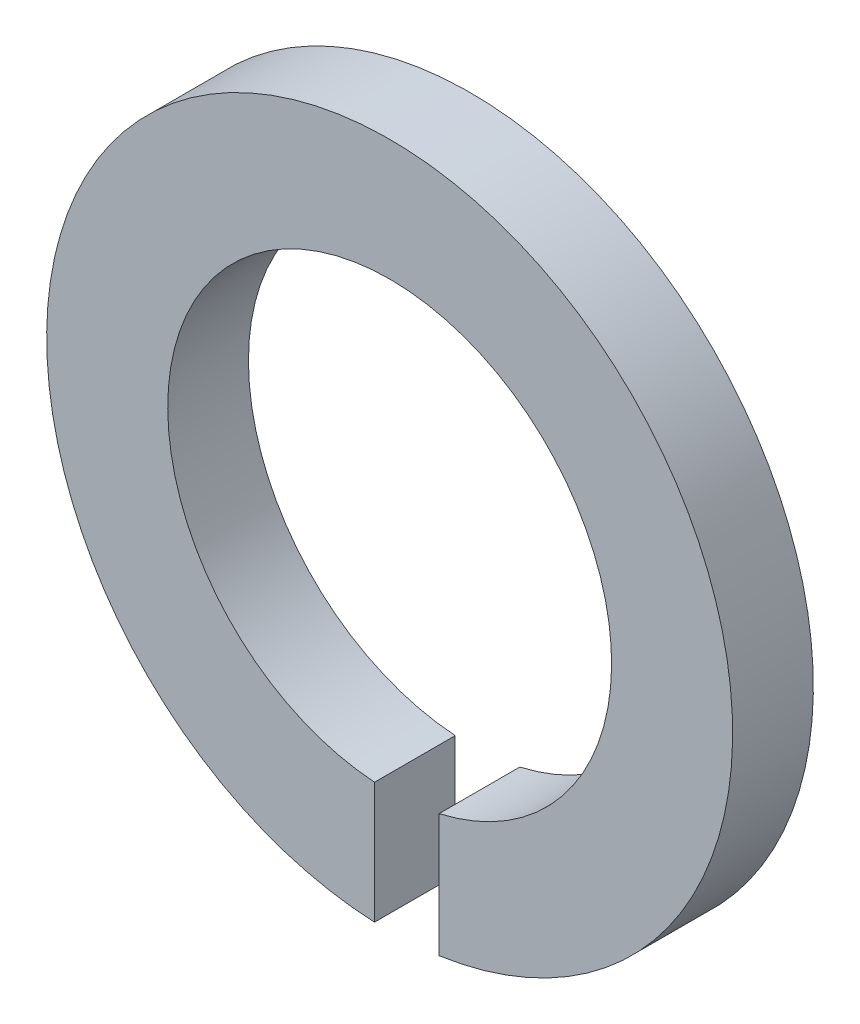
ISO-10303-21;
HEADER;
FILE_DESCRIPTION(('STEP AP214'),'2;1');
FILE_NAME('part.step','',(''),(''),'','','');
FILE_SCHEMA(('AUTOMOTIVE_DESIGN { 1 0 10303 214 1 1 1 1 }'));
ENDSEC;
DATA;
#1=APPLICATION_CONTEXT('core data for automotive mechanical design processes');
#2=APPLICATION_PROTOCOL_DEFINITION('international standard','automotive_design',2000,#1);
#3=PRODUCT_CONTEXT('',#1,'mechanical');
#4=PRODUCT('Part','Part','',(#3));
#5=PRODUCT_RELATED_PRODUCT_CATEGORY('part','',(#4));
#6=PRODUCT_DEFINITION_FORMATION('','',#4);
#7=PRODUCT_DEFINITION_CONTEXT('part definition',#1,'design');
#8=PRODUCT_DEFINITION('design','',#6,#7);
#9=PRODUCT_DEFINITION_SHAPE('','',#8);
#10=(LENGTH_UNIT() NAMED_UNIT(*) SI_UNIT(.MILLI.,.METRE.));
#11=(NAMED_UNIT(*) PLANE_ANGLE_UNIT() SI_UNIT($,.RADIAN.));
#12=(NAMED_UNIT(*) SI_UNIT($,.STERADIAN.) SOLID_ANGLE_UNIT());
#13=UNCERTAINTY_MEASURE_WITH_UNIT(LENGTH_MEASURE(1.E-05),#10,'distance_accuracy_value','');
#14=(GEOMETRIC_REPRESENTATION_CONTEXT(3) GLOBAL_UNCERTAINTY_ASSIGNED_CONTEXT((#13)) GLOBAL_UNIT_ASSIGNED_CONTEXT((#10,
#11,#12)) REPRESENTATION_CONTEXT('',''));
#15=CARTESIAN_POINT('',(0.,0.,0.));
#16=DIRECTION('',(0.,0.,1.));
#17=DIRECTION('',(1.,0.,0.));
#18=AXIS2_PLACEMENT_3D('',#15,#16,#17);
#19=CARTESIAN_POINT('',(0.,0.,0.));
#20=DIRECTION('',(0.,0.,1.));
#21=DIRECTION('',(1.,0.,0.));
#22=AXIS2_PLACEMENT_3D('',#19,#20,#21);
#23=PLANE('',#22);
#24=DIRECTION('',(0.,1.,0.));
#25=VECTOR('',#24,1.);
#26=CARTESIAN_POINT('',(0.49,-3.4,0.));
#27=LINE('',#26,#25);
#28=CARTESIAN_POINT('',(0.49,-2.14473774620582,0.));
#29=VERTEX_POINT('',#28);
#30=CARTESIAN_POINT('',(0.49,-3.36450590726187,0.));
#31=VERTEX_POINT('',#30);
#32=EDGE_CURVE('E77',#29,#31,#27,.F.);
#33=ORIENTED_EDGE('',*,*,#32,.T.);
#34=CARTESIAN_POINT('',(0.,0.,0.));
#35=DIRECTION('',(0.,0.,1.));
#36=DIRECTION('',(1.,0.,0.));
#37=AXIS2_PLACEMENT_3D('',#34,#35,#36);
#38=CIRCLE('',#37,3.4);
#39=CARTESIAN_POINT('',(-0.15,-3.39668956485576,0.));
#40=VERTEX_POINT('',#39);
#41=EDGE_CURVE('E20',#40,#31,#38,.F.);
#42=ORIENTED_EDGE('',*,*,#41,.F.);
#43=DIRECTION('',(0.,1.,0.));
#44=VECTOR('',#43,1.);
#45=CARTESIAN_POINT('',(-0.15,-3.4,0.));
#46=LINE('',#45,#44);
#47=CARTESIAN_POINT('',(-0.15,-2.1948804067648,0.));
#48=VERTEX_POINT('',#47);
#49=EDGE_CURVE('E62',#40,#48,#46,.T.);
#50=ORIENTED_EDGE('',*,*,#49,.T.);
#51=CARTESIAN_POINT('',(0.,0.,0.));
#52=DIRECTION('',(0.,0.,1.));
#53=DIRECTION('',(1.,0.,0.));
#54=AXIS2_PLACEMENT_3D('',#51,#52,#53);
#55=CIRCLE('',#54,2.2);
#56=EDGE_CURVE('E78',#48,#29,#55,.F.);
#57=ORIENTED_EDGE('',*,*,#56,.T.);
#58=EDGE_LOOP('',(#33,#42,#50,#57));
#59=FACE_BOUND('',#58,.T.);
#60=ADVANCED_FACE('F17',(#59),#23,.T.);
#61=CARTESIAN_POINT('',(0.49,-3.4,0.));
#62=DIRECTION('',(1.,0.,0.));
#63=DIRECTION('',(0.,0.,-1.));
#64=AXIS2_PLACEMENT_3D('',#61,#62,#63);
#65=PLANE('',#64);
#66=ORIENTED_EDGE('',*,*,#32,.F.);
#67=DIRECTION('',(0.,0.,1.));
#68=VECTOR('',#67,1.);
#69=CARTESIAN_POINT('',(0.489999999999999,-2.14473774620582,-0.8));
#70=LINE('',#69,#68);
#71=CARTESIAN_POINT('',(0.49,-2.14473774620582,-0.8));
#72=VERTEX_POINT('',#71);
#73=EDGE_CURVE('E100',#29,#72,#70,.F.);
#74=ORIENTED_EDGE('',*,*,#73,.T.);
#75=DIRECTION('',(0.,1.,0.));
#76=VECTOR('',#75,1.);
#77=CARTESIAN_POINT('',(0.49,0.,-0.8));
#78=LINE('',#77,#76);
#79=CARTESIAN_POINT('',(0.49,-3.36450590726187,-0.8));
#80=VERTEX_POINT('',#79);
#81=EDGE_CURVE('E87',#72,#80,#78,.F.);
#82=ORIENTED_EDGE('',*,*,#81,.T.);
#83=DIRECTION('',(0.,0.,1.));
#84=VECTOR('',#83,1.);
#85=CARTESIAN_POINT('',(0.489999999999999,-3.36450590726187,-0.8));
#86=LINE('',#85,#84);
#87=EDGE_CURVE('E71',#31,#80,#86,.F.);
#88=ORIENTED_EDGE('',*,*,#87,.F.);
#89=EDGE_LOOP('',(#66,#74,#82,#88));
#90=FACE_BOUND('',#89,.T.);
#91=ADVANCED_FACE('F85',(#90),#65,.F.);
#92=CARTESIAN_POINT('',(0.,0.,-0.8));
#93=DIRECTION('',(0.,0.,1.));
#94=DIRECTION('',(1.,0.,0.));
#95=AXIS2_PLACEMENT_3D('',#92,#93,#94);
#96=CYLINDRICAL_SURFACE('',#95,3.4);
#97=DIRECTION('',(0.,0.,1.));
#98=VECTOR('',#97,1.);
#99=CARTESIAN_POINT('',(-0.15,-3.39668956485576,0.));
#100=LINE('',#99,#98);
#101=CARTESIAN_POINT('',(-0.15,-3.39668956485576,-0.8));
#102=VERTEX_POINT('',#101);
#103=EDGE_CURVE('E73',#102,#40,#100,.T.);
#104=ORIENTED_EDGE('',*,*,#103,.T.);
#105=ORIENTED_EDGE('',*,*,#41,.T.);
#106=ORIENTED_EDGE('',*,*,#87,.T.);
#107=CARTESIAN_POINT('',(0.,0.,-0.8));
#108=DIRECTION('',(0.,0.,1.));
#109=DIRECTION('',(1.,0.,0.));
#110=AXIS2_PLACEMENT_3D('',#107,#108,#109);
#111=CIRCLE('',#110,3.4);
#112=EDGE_CURVE('E97',#80,#102,#111,.T.);
#113=ORIENTED_EDGE('',*,*,#112,.T.);
#114=EDGE_LOOP('',(#104,#105,#106,#113));
#115=FACE_BOUND('',#114,.T.);
#116=ADVANCED_FACE('F69',(#115),#96,.T.);
#117=CARTESIAN_POINT('',(-0.15,-3.4,0.));
#118=DIRECTION('',(-1.,0.,0.));
#119=DIRECTION('',(0.,0.,1.));
#120=AXIS2_PLACEMENT_3D('',#117,#118,#119);
#121=PLANE('',#120);
#122=DIRECTION('',(0.,1.,0.));
#123=VECTOR('',#122,1.);
#124=CARTESIAN_POINT('',(-0.15,0.,-0.8));
#125=LINE('',#124,#123);
#126=CARTESIAN_POINT('',(-0.15,-2.1948804067648,-0.8));
#127=VERTEX_POINT('',#126);
#128=EDGE_CURVE('E27',#102,#127,#125,.T.);
#129=ORIENTED_EDGE('',*,*,#128,.T.);
#130=DIRECTION('',(0.,0.,1.));
#131=VECTOR('',#130,1.);
#132=CARTESIAN_POINT('',(-0.149999999999999,-2.1948804067648,-0.8));
#133=LINE('',#132,#131);
#134=EDGE_CURVE('E39',#127,#48,#133,.T.);
#135=ORIENTED_EDGE('',*,*,#134,.T.);
#136=ORIENTED_EDGE('',*,*,#49,.F.);
#137=ORIENTED_EDGE('',*,*,#103,.F.);
#138=EDGE_LOOP('',(#129,#135,#136,#137));
#139=FACE_BOUND('',#138,.T.);
#140=ADVANCED_FACE('F110',(#139),#121,.F.);
#141=CARTESIAN_POINT('',(0.,0.,-0.8));
#142=DIRECTION('',(0.,0.,1.));
#143=DIRECTION('',(1.,0.,0.));
#144=AXIS2_PLACEMENT_3D('',#141,#142,#143);
#145=CYLINDRICAL_SURFACE('',#144,2.2);
#146=CARTESIAN_POINT('',(0.,0.,-0.8));
#147=DIRECTION('',(0.,0.,1.));
#148=DIRECTION('',(1.,0.,0.));
#149=AXIS2_PLACEMENT_3D('',#146,#147,#148);
#150=CIRCLE('',#149,2.2);
#151=EDGE_CURVE('E11',#127,#72,#150,.F.);
#152=ORIENTED_EDGE('',*,*,#151,.T.);
#153=ORIENTED_EDGE('',*,*,#73,.F.);
#154=ORIENTED_EDGE('',*,*,#56,.F.);
#155=ORIENTED_EDGE('',*,*,#134,.F.);
#156=EDGE_LOOP('',(#152,#153,#154,#155));
#157=FACE_BOUND('',#156,.T.);
#158=ADVANCED_FACE('F113',(#157),#145,.F.);
#159=CARTESIAN_POINT('',(0.,0.,-0.8));
#160=DIRECTION('',(0.,0.,1.));
#161=DIRECTION('',(1.,0.,0.));
#162=AXIS2_PLACEMENT_3D('',#159,#160,#161);
#163=PLANE('',#162);
#164=ORIENTED_EDGE('',*,*,#81,.F.);
#165=ORIENTED_EDGE('',*,*,#151,.F.);
#166=ORIENTED_EDGE('',*,*,#128,.F.);
#167=ORIENTED_EDGE('',*,*,#112,.F.);
#168=EDGE_LOOP('',(#164,#165,#166,#167));
#169=FACE_BOUND('',#168,.T.);
#170=ADVANCED_FACE('F112',(#169),#163,.F.);
#171=CLOSED_SHELL('',(#60,#91,#116,#140,#158,#170));
#172=MANIFOLD_SOLID_BREP('B1',#171);
#173=ADVANCED_BREP_SHAPE_REPRESENTATION('',(#18,#172),#14);
#174=SHAPE_DEFINITION_REPRESENTATION(#9,#173);
ENDSEC;
END-ISO-10303-21;
